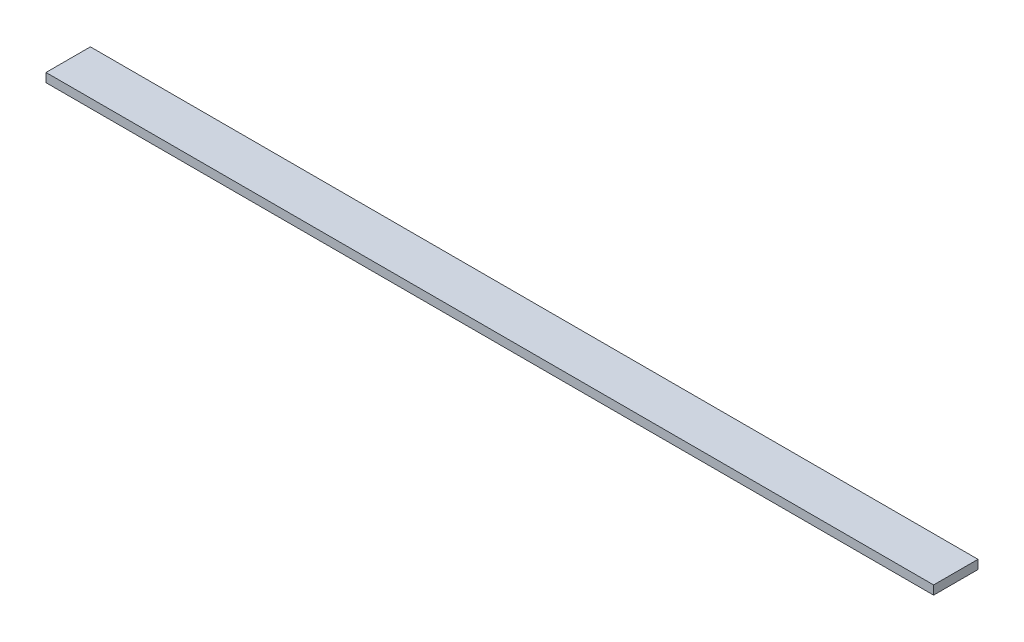
ISO-10303-21;
HEADER;
FILE_DESCRIPTION(('STEP AP214'),'2;1');
FILE_NAME('part.step','',(''),(''),'','','');
FILE_SCHEMA(('AUTOMOTIVE_DESIGN { 1 0 10303 214 1 1 1 1 }'));
ENDSEC;
DATA;
#1=APPLICATION_CONTEXT('core data for automotive mechanical design processes');
#2=APPLICATION_PROTOCOL_DEFINITION('international standard','automotive_design',2000,#1);
#3=PRODUCT_CONTEXT('',#1,'mechanical');
#4=PRODUCT('Part','Part','',(#3));
#5=PRODUCT_RELATED_PRODUCT_CATEGORY('part','',(#4));
#6=PRODUCT_DEFINITION_FORMATION('','',#4);
#7=PRODUCT_DEFINITION_CONTEXT('part definition',#1,'design');
#8=PRODUCT_DEFINITION('design','',#6,#7);
#9=PRODUCT_DEFINITION_SHAPE('','',#8);
#10=(LENGTH_UNIT() NAMED_UNIT(*) SI_UNIT(.MILLI.,.METRE.));
#11=(NAMED_UNIT(*) PLANE_ANGLE_UNIT() SI_UNIT($,.RADIAN.));
#12=(NAMED_UNIT(*) SI_UNIT($,.STERADIAN.) SOLID_ANGLE_UNIT());
#13=UNCERTAINTY_MEASURE_WITH_UNIT(LENGTH_MEASURE(1.E-05),#10,'distance_accuracy_value','');
#14=(GEOMETRIC_REPRESENTATION_CONTEXT(3) GLOBAL_UNCERTAINTY_ASSIGNED_CONTEXT((#13)) GLOBAL_UNIT_ASSIGNED_CONTEXT((#10,
#11,#12)) REPRESENTATION_CONTEXT('',''));
#15=CARTESIAN_POINT('',(0.,0.,0.));
#16=DIRECTION('',(0.,0.,1.));
#17=DIRECTION('',(1.,0.,0.));
#18=AXIS2_PLACEMENT_3D('',#15,#16,#17);
#19=CARTESIAN_POINT('',(150.,1040.,-800.));
#20=DIRECTION('',(-1.,0.,0.));
#21=DIRECTION('',(0.,0.,1.));
#22=AXIS2_PLACEMENT_3D('',#19,#20,#21);
#23=PLANE('',#22);
#24=DIRECTION('',(0.,-1.,0.));
#25=VECTOR('',#24,1.);
#26=CARTESIAN_POINT('',(150.,1040.,-780.));
#27=LINE('',#26,#25);
#28=CARTESIAN_POINT('',(150.,1044.,-780.));
#29=VERTEX_POINT('',#28);
#30=CARTESIAN_POINT('',(150.,1040.,-780.));
#31=VERTEX_POINT('',#30);
#32=EDGE_CURVE('E103',#29,#31,#27,.T.);
#33=ORIENTED_EDGE('',*,*,#32,.F.);
#34=DIRECTION('',(0.,0.,1.));
#35=VECTOR('',#34,1.);
#36=CARTESIAN_POINT('',(150.,1044.,-800.));
#37=LINE('',#36,#35);
#38=CARTESIAN_POINT('',(150.,1044.,-800.));
#39=VERTEX_POINT('',#38);
#40=EDGE_CURVE('E11',#39,#29,#37,.T.);
#41=ORIENTED_EDGE('',*,*,#40,.F.);
#42=DIRECTION('',(0.,-1.,0.));
#43=VECTOR('',#42,1.);
#44=CARTESIAN_POINT('',(150.,1040.,-800.));
#45=LINE('',#44,#43);
#46=CARTESIAN_POINT('',(150.,1040.,-800.));
#47=VERTEX_POINT('',#46);
#48=EDGE_CURVE('E97',#39,#47,#45,.T.);
#49=ORIENTED_EDGE('',*,*,#48,.T.);
#50=DIRECTION('',(0.,0.,1.));
#51=VECTOR('',#50,1.);
#52=CARTESIAN_POINT('',(150.,1040.,-800.));
#53=LINE('',#52,#51);
#54=EDGE_CURVE('E42',#47,#31,#53,.T.);
#55=ORIENTED_EDGE('',*,*,#54,.T.);
#56=EDGE_LOOP('',(#33,#41,#49,#55));
#57=FACE_BOUND('',#56,.T.);
#58=ADVANCED_FACE('F39',(#57),#23,.T.);
#59=CARTESIAN_POINT('',(150.,1044.,-800.));
#60=DIRECTION('',(0.,1.,0.));
#61=DIRECTION('',(0.,0.,1.));
#62=AXIS2_PLACEMENT_3D('',#59,#60,#61);
#63=PLANE('',#62);
#64=DIRECTION('',(-1.,0.,0.));
#65=VECTOR('',#64,1.);
#66=CARTESIAN_POINT('',(150.,1044.,-780.));
#67=LINE('',#66,#65);
#68=CARTESIAN_POINT('',(550.,1044.,-780.));
#69=VERTEX_POINT('',#68);
#70=EDGE_CURVE('E99',#69,#29,#67,.T.);
#71=ORIENTED_EDGE('',*,*,#70,.F.);
#72=DIRECTION('',(0.,0.,1.));
#73=VECTOR('',#72,1.);
#74=CARTESIAN_POINT('',(550.,1044.,-800.));
#75=LINE('',#74,#73);
#76=CARTESIAN_POINT('',(550.,1044.,-800.));
#77=VERTEX_POINT('',#76);
#78=EDGE_CURVE('E48',#77,#69,#75,.T.);
#79=ORIENTED_EDGE('',*,*,#78,.F.);
#80=DIRECTION('',(-1.,0.,0.));
#81=VECTOR('',#80,1.);
#82=CARTESIAN_POINT('',(150.,1044.,-800.));
#83=LINE('',#82,#81);
#84=EDGE_CURVE('E94',#77,#39,#83,.T.);
#85=ORIENTED_EDGE('',*,*,#84,.T.);
#86=ORIENTED_EDGE('',*,*,#40,.T.);
#87=EDGE_LOOP('',(#71,#79,#85,#86));
#88=FACE_BOUND('',#87,.T.);
#89=ADVANCED_FACE('F113',(#88),#63,.T.);
#90=CARTESIAN_POINT('',(550.,1040.,-800.));
#91=DIRECTION('',(1.,0.,0.));
#92=DIRECTION('',(0.,0.,-1.));
#93=AXIS2_PLACEMENT_3D('',#90,#91,#92);
#94=PLANE('',#93);
#95=DIRECTION('',(0.,1.,0.));
#96=VECTOR('',#95,1.);
#97=CARTESIAN_POINT('',(550.,1040.,-780.));
#98=LINE('',#97,#96);
#99=CARTESIAN_POINT('',(550.,1040.,-780.));
#100=VERTEX_POINT('',#99);
#101=EDGE_CURVE('E89',#100,#69,#98,.T.);
#102=ORIENTED_EDGE('',*,*,#101,.F.);
#103=DIRECTION('',(0.,0.,1.));
#104=VECTOR('',#103,1.);
#105=CARTESIAN_POINT('',(550.,1040.,-800.));
#106=LINE('',#105,#104);
#107=CARTESIAN_POINT('',(550.,1040.,-800.));
#108=VERTEX_POINT('',#107);
#109=EDGE_CURVE('E84',#108,#100,#106,.T.);
#110=ORIENTED_EDGE('',*,*,#109,.F.);
#111=DIRECTION('',(0.,1.,0.));
#112=VECTOR('',#111,1.);
#113=CARTESIAN_POINT('',(550.,1040.,-800.));
#114=LINE('',#113,#112);
#115=EDGE_CURVE('E87',#108,#77,#114,.T.);
#116=ORIENTED_EDGE('',*,*,#115,.T.);
#117=ORIENTED_EDGE('',*,*,#78,.T.);
#118=EDGE_LOOP('',(#102,#110,#116,#117));
#119=FACE_BOUND('',#118,.T.);
#120=ADVANCED_FACE('F86',(#119),#94,.T.);
#121=CARTESIAN_POINT('',(150.,1040.,-800.));
#122=DIRECTION('',(0.,-1.,0.));
#123=DIRECTION('',(0.,0.,-1.));
#124=AXIS2_PLACEMENT_3D('',#121,#122,#123);
#125=PLANE('',#124);
#126=DIRECTION('',(1.,0.,0.));
#127=VECTOR('',#126,1.);
#128=CARTESIAN_POINT('',(150.,1040.,-780.));
#129=LINE('',#128,#127);
#130=EDGE_CURVE('E106',#31,#100,#129,.T.);
#131=ORIENTED_EDGE('',*,*,#130,.F.);
#132=ORIENTED_EDGE('',*,*,#54,.F.);
#133=DIRECTION('',(1.,0.,0.));
#134=VECTOR('',#133,1.);
#135=CARTESIAN_POINT('',(150.,1040.,-800.));
#136=LINE('',#135,#134);
#137=EDGE_CURVE('E93',#47,#108,#136,.T.);
#138=ORIENTED_EDGE('',*,*,#137,.T.);
#139=ORIENTED_EDGE('',*,*,#109,.T.);
#140=EDGE_LOOP('',(#131,#132,#138,#139));
#141=FACE_BOUND('',#140,.T.);
#142=ADVANCED_FACE('F96',(#141),#125,.T.);
#143=CARTESIAN_POINT('',(0.,0.,-800.));
#144=DIRECTION('',(0.,0.,-1.));
#145=DIRECTION('',(-1.,0.,0.));
#146=AXIS2_PLACEMENT_3D('',#143,#144,#145);
#147=PLANE('',#146);
#148=ORIENTED_EDGE('',*,*,#48,.F.);
#149=ORIENTED_EDGE('',*,*,#84,.F.);
#150=ORIENTED_EDGE('',*,*,#115,.F.);
#151=ORIENTED_EDGE('',*,*,#137,.F.);
#152=EDGE_LOOP('',(#148,#149,#150,#151));
#153=FACE_BOUND('',#152,.T.);
#154=ADVANCED_FACE('F92',(#153),#147,.T.);
#155=CARTESIAN_POINT('',(0.,0.,-780.));
#156=DIRECTION('',(0.,0.,-1.));
#157=DIRECTION('',(-1.,0.,0.));
#158=AXIS2_PLACEMENT_3D('',#155,#156,#157);
#159=PLANE('',#158);
#160=ORIENTED_EDGE('',*,*,#32,.T.);
#161=ORIENTED_EDGE('',*,*,#130,.T.);
#162=ORIENTED_EDGE('',*,*,#101,.T.);
#163=ORIENTED_EDGE('',*,*,#70,.T.);
#164=EDGE_LOOP('',(#160,#161,#162,#163));
#165=FACE_BOUND('',#164,.T.);
#166=ADVANCED_FACE('F112',(#165),#159,.F.);
#167=CLOSED_SHELL('',(#58,#89,#120,#142,#154,#166));
#168=MANIFOLD_SOLID_BREP('B2',#167);
#169=ADVANCED_BREP_SHAPE_REPRESENTATION('',(#18,#168),#14);
#170=SHAPE_DEFINITION_REPRESENTATION(#9,#169);
ENDSEC;
END-ISO-10303-21;
